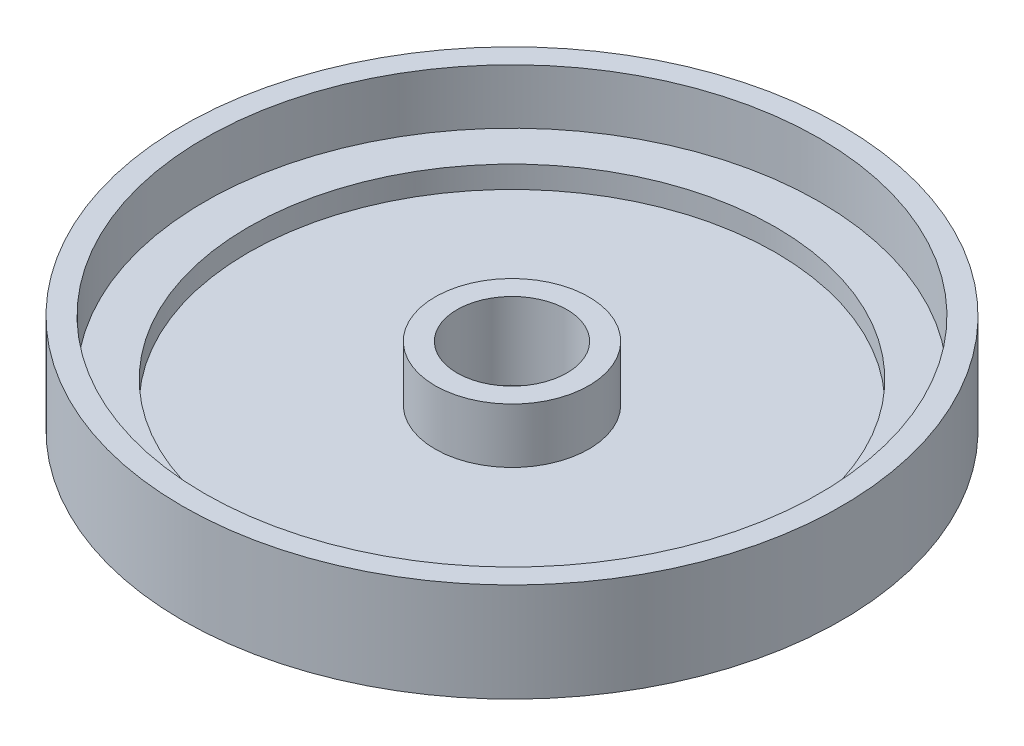
ISO-10303-21;
HEADER;
FILE_DESCRIPTION(('STEP AP214'),'2;1');
FILE_NAME('part.step','',(''),(''),'','','');
FILE_SCHEMA(('AUTOMOTIVE_DESIGN { 1 0 10303 214 1 1 1 1 }'));
ENDSEC;
DATA;
#1=APPLICATION_CONTEXT('core data for automotive mechanical design processes');
#2=APPLICATION_PROTOCOL_DEFINITION('international standard','automotive_design',2000,#1);
#3=PRODUCT_CONTEXT('',#1,'mechanical');
#4=PRODUCT('Part','Part','',(#3));
#5=PRODUCT_RELATED_PRODUCT_CATEGORY('part','',(#4));
#6=PRODUCT_DEFINITION_FORMATION('','',#4);
#7=PRODUCT_DEFINITION_CONTEXT('part definition',#1,'design');
#8=PRODUCT_DEFINITION('design','',#6,#7);
#9=PRODUCT_DEFINITION_SHAPE('','',#8);
#10=(LENGTH_UNIT() NAMED_UNIT(*) SI_UNIT(.MILLI.,.METRE.));
#11=(NAMED_UNIT(*) PLANE_ANGLE_UNIT() SI_UNIT($,.RADIAN.));
#12=(NAMED_UNIT(*) SI_UNIT($,.STERADIAN.) SOLID_ANGLE_UNIT());
#13=UNCERTAINTY_MEASURE_WITH_UNIT(LENGTH_MEASURE(1.E-05),#10,'distance_accuracy_value','');
#14=(GEOMETRIC_REPRESENTATION_CONTEXT(3) GLOBAL_UNCERTAINTY_ASSIGNED_CONTEXT((#13)) GLOBAL_UNIT_ASSIGNED_CONTEXT((#10,
#11,#12)) REPRESENTATION_CONTEXT('',''));
#15=CARTESIAN_POINT('',(0.,0.,0.));
#16=DIRECTION('',(0.,0.,1.));
#17=DIRECTION('',(1.,0.,0.));
#18=AXIS2_PLACEMENT_3D('',#15,#16,#17);
#19=CARTESIAN_POINT('',(0.,5.08,0.));
#20=DIRECTION('',(0.,1.,0.));
#21=DIRECTION('',(0.,0.,1.));
#22=AXIS2_PLACEMENT_3D('',#19,#20,#21);
#23=PLANE('',#22);
#24=CARTESIAN_POINT('',(0.,5.08,0.));
#25=DIRECTION('',(0.,1.,0.));
#26=DIRECTION('',(0.,0.,1.));
#27=AXIS2_PLACEMENT_3D('',#24,#25,#26);
#28=CIRCLE('',#27,30.48);
#29=CARTESIAN_POINT('',(0.,5.08,30.48));
#30=VERTEX_POINT('',#29);
#31=EDGE_CURVE('E66',#30,#30,#28,.T.);
#32=ORIENTED_EDGE('',*,*,#31,.F.);
#33=EDGE_LOOP('',(#32));
#34=FACE_BOUND('',#33,.T.);
#35=CARTESIAN_POINT('',(0.,5.08,0.));
#36=DIRECTION('',(0.,1.,0.));
#37=DIRECTION('',(0.,0.,1.));
#38=AXIS2_PLACEMENT_3D('',#35,#36,#37);
#39=CIRCLE('',#38,35.56);
#40=CARTESIAN_POINT('',(0.,5.08,35.56));
#41=VERTEX_POINT('',#40);
#42=EDGE_CURVE('E10',#41,#41,#39,.F.);
#43=ORIENTED_EDGE('',*,*,#42,.F.);
#44=EDGE_LOOP('',(#43));
#45=FACE_BOUND('',#44,.T.);
#46=ADVANCED_FACE('F37',(#34,#45),#23,.T.);
#47=CARTESIAN_POINT('',(0.,2.54,0.));
#48=DIRECTION('',(0.,1.,0.));
#49=DIRECTION('',(0.,0.,1.));
#50=AXIS2_PLACEMENT_3D('',#47,#48,#49);
#51=PLANE('',#50);
#52=CARTESIAN_POINT('',(0.,2.54,0.));
#53=DIRECTION('',(0.,1.,0.));
#54=DIRECTION('',(0.,0.,1.));
#55=AXIS2_PLACEMENT_3D('',#52,#53,#54);
#56=CIRCLE('',#55,8.89);
#57=CARTESIAN_POINT('',(0.,2.54,8.89));
#58=VERTEX_POINT('',#57);
#59=EDGE_CURVE('E58',#58,#58,#56,.T.);
#60=ORIENTED_EDGE('',*,*,#59,.F.);
#61=EDGE_LOOP('',(#60));
#62=FACE_BOUND('',#61,.T.);
#63=CARTESIAN_POINT('',(0.,2.54,0.));
#64=DIRECTION('',(0.,1.,0.));
#65=DIRECTION('',(0.,0.,1.));
#66=AXIS2_PLACEMENT_3D('',#63,#64,#65);
#67=CIRCLE('',#66,30.48);
#68=CARTESIAN_POINT('',(0.,2.54,30.48));
#69=VERTEX_POINT('',#68);
#70=EDGE_CURVE('E44',#69,#69,#67,.F.);
#71=ORIENTED_EDGE('',*,*,#70,.F.);
#72=EDGE_LOOP('',(#71));
#73=FACE_BOUND('',#72,.T.);
#74=ADVANCED_FACE('F93',(#62,#73),#51,.T.);
#75=CARTESIAN_POINT('',(0.,0.,0.));
#76=DIRECTION('',(0.,1.,0.));
#77=DIRECTION('',(0.,0.,1.));
#78=AXIS2_PLACEMENT_3D('',#75,#76,#77);
#79=PLANE('',#78);
#80=CARTESIAN_POINT('',(0.,0.,0.));
#81=DIRECTION('',(0.,1.,0.));
#82=DIRECTION('',(0.,0.,1.));
#83=AXIS2_PLACEMENT_3D('',#80,#81,#82);
#84=CIRCLE('',#83,38.1);
#85=CARTESIAN_POINT('',(0.,0.,38.1));
#86=VERTEX_POINT('',#85);
#87=EDGE_CURVE('E48',#86,#86,#84,.T.);
#88=ORIENTED_EDGE('',*,*,#87,.F.);
#89=EDGE_LOOP('',(#88));
#90=FACE_BOUND('',#89,.T.);
#91=CARTESIAN_POINT('',(0.,0.,0.));
#92=DIRECTION('',(0.,1.,0.));
#93=DIRECTION('',(0.,0.,1.));
#94=AXIS2_PLACEMENT_3D('',#91,#92,#93);
#95=CIRCLE('',#94,6.35);
#96=CARTESIAN_POINT('',(0.,0.,6.35));
#97=VERTEX_POINT('',#96);
#98=EDGE_CURVE('E52',#97,#97,#95,.T.);
#99=ORIENTED_EDGE('',*,*,#98,.T.);
#100=EDGE_LOOP('',(#99));
#101=FACE_BOUND('',#100,.T.);
#102=ADVANCED_FACE('F99',(#90,#101),#79,.F.);
#103=CARTESIAN_POINT('',(0.,2.54,0.));
#104=DIRECTION('',(0.,-1.,0.));
#105=DIRECTION('',(0.,0.,-1.));
#106=AXIS2_PLACEMENT_3D('',#103,#104,#105);
#107=CYLINDRICAL_SURFACE('',#106,38.1);
#108=ORIENTED_EDGE('',*,*,#87,.T.);
#109=EDGE_LOOP('',(#108));
#110=FACE_BOUND('',#109,.T.);
#111=CARTESIAN_POINT('',(0.,11.43,0.));
#112=DIRECTION('',(0.,1.,0.));
#113=DIRECTION('',(0.,0.,1.));
#114=AXIS2_PLACEMENT_3D('',#111,#112,#113);
#115=CIRCLE('',#114,38.1);
#116=CARTESIAN_POINT('',(0.,11.43,38.1));
#117=VERTEX_POINT('',#116);
#118=EDGE_CURVE('E69',#117,#117,#115,.T.);
#119=ORIENTED_EDGE('',*,*,#118,.F.);
#120=EDGE_LOOP('',(#119));
#121=FACE_BOUND('',#120,.T.);
#122=ADVANCED_FACE('F39',(#110,#121),#107,.T.);
#123=CARTESIAN_POINT('',(0.,2.54,0.));
#124=DIRECTION('',(0.,-1.,0.));
#125=DIRECTION('',(0.,0.,-1.));
#126=AXIS2_PLACEMENT_3D('',#123,#124,#125);
#127=CYLINDRICAL_SURFACE('',#126,6.35);
#128=ORIENTED_EDGE('',*,*,#98,.F.);
#129=EDGE_LOOP('',(#128));
#130=FACE_BOUND('',#129,.T.);
#131=CARTESIAN_POINT('',(0.,8.89,0.));
#132=DIRECTION('',(0.,1.,0.));
#133=DIRECTION('',(0.,0.,1.));
#134=AXIS2_PLACEMENT_3D('',#131,#132,#133);
#135=CIRCLE('',#134,6.35);
#136=CARTESIAN_POINT('',(0.,8.89,6.35));
#137=VERTEX_POINT('',#136);
#138=EDGE_CURVE('E61',#137,#137,#135,.T.);
#139=ORIENTED_EDGE('',*,*,#138,.T.);
#140=EDGE_LOOP('',(#139));
#141=FACE_BOUND('',#140,.T.);
#142=ADVANCED_FACE('F108',(#130,#141),#127,.F.);
#143=CARTESIAN_POINT('',(0.,8.89,0.));
#144=DIRECTION('',(0.,1.,0.));
#145=DIRECTION('',(0.,0.,1.));
#146=AXIS2_PLACEMENT_3D('',#143,#144,#145);
#147=PLANE('',#146);
#148=CARTESIAN_POINT('',(0.,8.89,0.));
#149=DIRECTION('',(0.,1.,0.));
#150=DIRECTION('',(0.,0.,1.));
#151=AXIS2_PLACEMENT_3D('',#148,#149,#150);
#152=CIRCLE('',#151,8.89);
#153=CARTESIAN_POINT('',(0.,8.89,8.89));
#154=VERTEX_POINT('',#153);
#155=EDGE_CURVE('E57',#154,#154,#152,.T.);
#156=ORIENTED_EDGE('',*,*,#155,.T.);
#157=EDGE_LOOP('',(#156));
#158=FACE_BOUND('',#157,.T.);
#159=ORIENTED_EDGE('',*,*,#138,.F.);
#160=EDGE_LOOP('',(#159));
#161=FACE_BOUND('',#160,.T.);
#162=ADVANCED_FACE('F105',(#158,#161),#147,.T.);
#163=CARTESIAN_POINT('',(0.,8.89,0.));
#164=DIRECTION('',(0.,-1.,0.));
#165=DIRECTION('',(0.,0.,-1.));
#166=AXIS2_PLACEMENT_3D('',#163,#164,#165);
#167=CYLINDRICAL_SURFACE('',#166,8.89);
#168=ORIENTED_EDGE('',*,*,#155,.F.);
#169=EDGE_LOOP('',(#168));
#170=FACE_BOUND('',#169,.T.);
#171=ORIENTED_EDGE('',*,*,#59,.T.);
#172=EDGE_LOOP('',(#171));
#173=FACE_BOUND('',#172,.T.);
#174=ADVANCED_FACE('F89',(#170,#173),#167,.T.);
#175=CARTESIAN_POINT('',(0.,5.08,0.));
#176=DIRECTION('',(0.,-1.,0.));
#177=DIRECTION('',(0.,0.,-1.));
#178=AXIS2_PLACEMENT_3D('',#175,#176,#177);
#179=CYLINDRICAL_SURFACE('',#178,30.48);
#180=ORIENTED_EDGE('',*,*,#31,.T.);
#181=EDGE_LOOP('',(#180));
#182=FACE_BOUND('',#181,.T.);
#183=ORIENTED_EDGE('',*,*,#70,.T.);
#184=EDGE_LOOP('',(#183));
#185=FACE_BOUND('',#184,.T.);
#186=ADVANCED_FACE('F80',(#182,#185),#179,.F.);
#187=CARTESIAN_POINT('',(0.,11.43,0.));
#188=DIRECTION('',(0.,1.,0.));
#189=DIRECTION('',(0.,0.,1.));
#190=AXIS2_PLACEMENT_3D('',#187,#188,#189);
#191=PLANE('',#190);
#192=ORIENTED_EDGE('',*,*,#118,.T.);
#193=EDGE_LOOP('',(#192));
#194=FACE_BOUND('',#193,.T.);
#195=CARTESIAN_POINT('',(0.,11.43,0.));
#196=DIRECTION('',(0.,1.,0.));
#197=DIRECTION('',(0.,0.,1.));
#198=AXIS2_PLACEMENT_3D('',#195,#196,#197);
#199=CIRCLE('',#198,35.56);
#200=CARTESIAN_POINT('',(0.,11.43,35.56));
#201=VERTEX_POINT('',#200);
#202=EDGE_CURVE('E72',#201,#201,#199,.T.);
#203=ORIENTED_EDGE('',*,*,#202,.F.);
#204=EDGE_LOOP('',(#203));
#205=FACE_BOUND('',#204,.T.);
#206=ADVANCED_FACE('F78',(#194,#205),#191,.T.);
#207=CARTESIAN_POINT('',(0.,11.43,0.));
#208=DIRECTION('',(0.,-1.,0.));
#209=DIRECTION('',(0.,0.,-1.));
#210=AXIS2_PLACEMENT_3D('',#207,#208,#209);
#211=CYLINDRICAL_SURFACE('',#210,35.56);
#212=ORIENTED_EDGE('',*,*,#202,.T.);
#213=EDGE_LOOP('',(#212));
#214=FACE_BOUND('',#213,.T.);
#215=ORIENTED_EDGE('',*,*,#42,.T.);
#216=EDGE_LOOP('',(#215));
#217=FACE_BOUND('',#216,.T.);
#218=ADVANCED_FACE('F76',(#214,#217),#211,.F.);
#219=CLOSED_SHELL('',(#46,#74,#102,#122,#142,#162,#174,#186,#206,#218));
#220=MANIFOLD_SOLID_BREP('B2',#219);
#221=ADVANCED_BREP_SHAPE_REPRESENTATION('',(#18,#220),#14);
#222=SHAPE_DEFINITION_REPRESENTATION(#9,#221);
ENDSEC;
END-ISO-10303-21;
